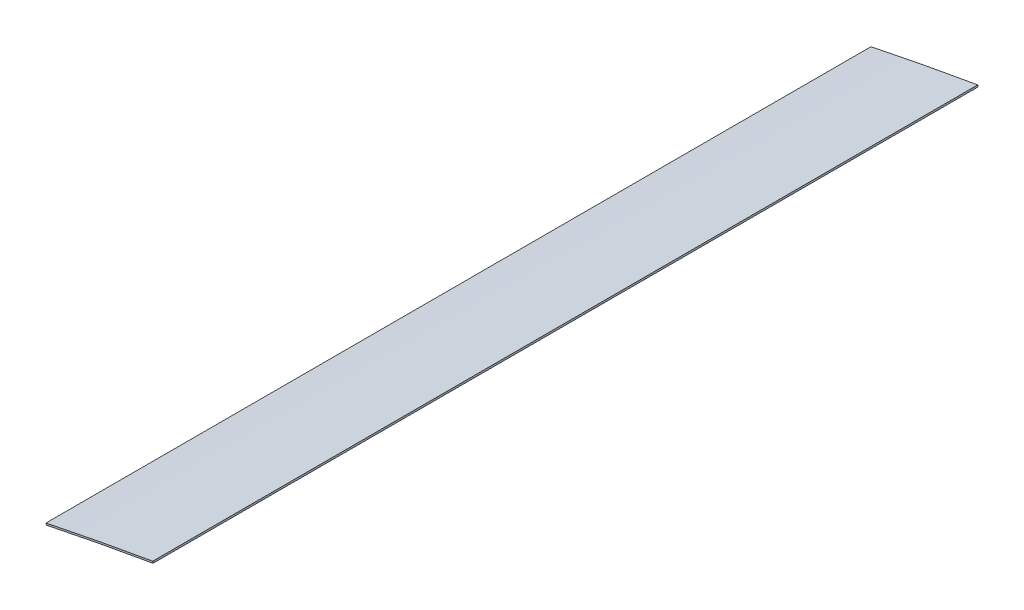
ISO-10303-21;
HEADER;
FILE_DESCRIPTION(('STEP AP214'),'2;1');
FILE_NAME('part.step','',(''),(''),'','','');
FILE_SCHEMA(('AUTOMOTIVE_DESIGN { 1 0 10303 214 1 1 1 1 }'));
ENDSEC;
DATA;
#1=APPLICATION_CONTEXT('core data for automotive mechanical design processes');
#2=APPLICATION_PROTOCOL_DEFINITION('international standard','automotive_design',2000,#1);
#3=PRODUCT_CONTEXT('',#1,'mechanical');
#4=PRODUCT('Part','Part','',(#3));
#5=PRODUCT_RELATED_PRODUCT_CATEGORY('part','',(#4));
#6=PRODUCT_DEFINITION_FORMATION('','',#4);
#7=PRODUCT_DEFINITION_CONTEXT('part definition',#1,'design');
#8=PRODUCT_DEFINITION('design','',#6,#7);
#9=PRODUCT_DEFINITION_SHAPE('','',#8);
#10=(LENGTH_UNIT() NAMED_UNIT(*) SI_UNIT(.MILLI.,.METRE.));
#11=(NAMED_UNIT(*) PLANE_ANGLE_UNIT() SI_UNIT($,.RADIAN.));
#12=(NAMED_UNIT(*) SI_UNIT($,.STERADIAN.) SOLID_ANGLE_UNIT());
#13=UNCERTAINTY_MEASURE_WITH_UNIT(LENGTH_MEASURE(1.E-05),#10,'distance_accuracy_value','');
#14=(GEOMETRIC_REPRESENTATION_CONTEXT(3) GLOBAL_UNCERTAINTY_ASSIGNED_CONTEXT((#13)) GLOBAL_UNIT_ASSIGNED_CONTEXT((#10,
#11,#12)) REPRESENTATION_CONTEXT('',''));
#15=CARTESIAN_POINT('',(0.,0.,0.));
#16=DIRECTION('',(0.,0.,1.));
#17=DIRECTION('',(1.,0.,0.));
#18=AXIS2_PLACEMENT_3D('',#15,#16,#17);
#19=CARTESIAN_POINT('',(-370.271261275174,5.9727732812786,0.));
#20=DIRECTION('',(0.,0.,-1.));
#21=DIRECTION('',(-1.,0.,0.));
#22=AXIS2_PLACEMENT_3D('',#19,#20,#21);
#23=PLANE('',#22);
#24=CARTESIAN_POINT('',(-345.86921952559,10.4034628772873,0.));
#25=CARTESIAN_POINT('',(-349.94203818241,9.69772573854356,0.));
#26=CARTESIAN_POINT('',(-354.012729452607,8.97586416354941,0.));
#27=CARTESIAN_POINT('',(-362.145804591733,7.49934641335859,0.));
#28=CARTESIAN_POINT('',(-366.208147824963,6.74469758212919,0.));
#29=CARTESIAN_POINT('',(-374.334374725386,5.20084898042798,0.));
#30=CARTESIAN_POINT('',(-378.39841229257,4.41162013750127,0.));
#31=CARTESIAN_POINT('',(-384.468085361271,3.20342240883662,0.));
#32=CARTESIAN_POINT('',(-386.486607452505,2.79669155578354,0.));
#33=CARTESIAN_POINT('',(-389.536193606057,2.17804701871457,0.));
#34=CARTESIAN_POINT('',(-390.556809742196,1.97031577031353,0.));
#35=CARTESIAN_POINT('',(-392.57724176466,1.55449947413365,0.));
#36=CARTESIAN_POINT('',(-393.576500528704,1.34652869413316,0.));
#37=CARTESIAN_POINT('',(-394.58041783956,1.13592020313479,0.));
#38=B_SPLINE_CURVE_WITH_KNOTS('',3,(#24,#25,#26,#27,#28,#29,#30,#31,#32,#33,#34,#35,#36,#37),
.UNSPECIFIED.,.F.,.F.,(4,2,2,2,2,2,4),(0.,0.250000000000001,0.500000000000002,0.750000000000002,
0.875000000000001,0.937500000000001,1.),.UNSPECIFIED.);
#39=CARTESIAN_POINT('',(-345.86921952559,10.4034628772873,0.));
#40=VERTEX_POINT('',#39);
#41=CARTESIAN_POINT('',(-394.58041783956,1.13592020313479,0.));
#42=VERTEX_POINT('',#41);
#43=EDGE_CURVE('E85',#40,#42,#38,.T.);
#44=ORIENTED_EDGE('',*,*,#43,.T.);
#45=DIRECTION('',(-0.20531728339943,0.97869546496215,0.));
#46=VECTOR('',#45,1.);
#47=CARTESIAN_POINT('',(-394.417447245861,0.35908067782108,0.));
#48=LINE('',#47,#46);
#49=CARTESIAN_POINT('',(-394.417447245861,0.35908067782108,0.));
#50=VERTEX_POINT('',#49);
#51=EDGE_CURVE('E86',#50,#42,#48,.T.);
#52=ORIENTED_EDGE('',*,*,#51,.F.);
#53=CARTESIAN_POINT('',(-345.733698222766,9.62136758962672,0.));
#54=CARTESIAN_POINT('',(-349.80446700653,8.91598565244432,0.));
#55=CARTESIAN_POINT('',(-357.941676377794,7.47300220886799,0.));
#56=CARTESIAN_POINT('',(-370.122332339644,5.21023980034695,0.));
#57=CARTESIAN_POINT('',(-380.276776503847,3.23826298733725,0.));
#58=CARTESIAN_POINT('',(-387.338257037827,1.81538118105775,0.));
#59=CARTESIAN_POINT('',(-391.417841987052,0.98503984916554,0.));
#60=CARTESIAN_POINT('',(-393.414350382232,0.569517049910392,0.));
#61=CARTESIAN_POINT('',(-394.417447245861,0.35908067782108,0.));
#62=B_SPLINE_CURVE_WITH_KNOTS('',3,(#53,#54,#55,#56,#57,#58,#59,#60,#61),.UNSPECIFIED.,.F.,.F.,
(4,1,1,1,1,1,4),(0.00676290299753232,0.0219498603868585,0.0371368177761848,0.052323775165511,
0.0599172538601741,0.0637139932075056,0.0675107325548372),.UNSPECIFIED.);
#63=CARTESIAN_POINT('',(-345.733698222766,9.62136758962672,0.));
#64=VERTEX_POINT('',#63);
#65=EDGE_CURVE('E94',#64,#50,#62,.T.);
#66=ORIENTED_EDGE('',*,*,#65,.F.);
#67=DIRECTION('',(0.170735499620878,-0.985316897840085,0.));
#68=VECTOR('',#67,1.);
#69=CARTESIAN_POINT('',(-345.86921952559,10.4034628772873,0.));
#70=LINE('',#69,#68);
#71=EDGE_CURVE('E88',#40,#64,#70,.T.);
#72=ORIENTED_EDGE('',*,*,#71,.F.);
#73=EDGE_LOOP('',(#44,#52,#66,#72));
#74=FACE_BOUND('',#73,.T.);
#75=ADVANCED_FACE('F39',(#74),#23,.F.);
#76=CARTESIAN_POINT('',(-394.417447245861,0.35908067782108,-426.357025279608));
#77=DIRECTION('',(0.97869546496215,0.20531728339943,0.));
#78=DIRECTION('',(-0.20531728339943,0.97869546496215,0.));
#79=AXIS2_PLACEMENT_3D('',#76,#77,#78);
#80=PLANE('',#79);
#81=DIRECTION('',(0.,0.,1.));
#82=VECTOR('',#81,1.);
#83=CARTESIAN_POINT('',(-394.58041783956,1.13592020313479,-426.357025279608));
#84=LINE('',#83,#82);
#85=CARTESIAN_POINT('',(-394.58041783956,1.13592020313479,-376.48828125));
#86=VERTEX_POINT('',#85);
#87=EDGE_CURVE('E78',#86,#42,#84,.T.);
#88=ORIENTED_EDGE('',*,*,#87,.F.);
#89=DIRECTION('',(0.20531728339943,-0.97869546496215,0.));
#90=VECTOR('',#89,1.);
#91=CARTESIAN_POINT('',(-394.417447245861,0.35908067782108,-376.48828125));
#92=LINE('',#91,#90);
#93=CARTESIAN_POINT('',(-394.417447245861,0.35908067782108,-376.48828125));
#94=VERTEX_POINT('',#93);
#95=EDGE_CURVE('E42',#86,#94,#92,.T.);
#96=ORIENTED_EDGE('',*,*,#95,.T.);
#97=DIRECTION('',(0.,0.,1.));
#98=VECTOR('',#97,1.);
#99=CARTESIAN_POINT('',(-394.417447245861,0.35908067782108,-426.357025279608));
#100=LINE('',#99,#98);
#101=EDGE_CURVE('E83',#94,#50,#100,.T.);
#102=ORIENTED_EDGE('',*,*,#101,.T.);
#103=ORIENTED_EDGE('',*,*,#51,.T.);
#104=EDGE_LOOP('',(#88,#96,#102,#103));
#105=FACE_BOUND('',#104,.T.);
#106=ADVANCED_FACE('F90',(#105),#80,.F.);
#107=CARTESIAN_POINT('',(-345.733698222766,9.62136758962672,-426.357025279608));
#108=CARTESIAN_POINT('',(-349.80446700653,8.91598565244432,-426.357025279608));
#109=CARTESIAN_POINT('',(-357.941676377794,7.47300220886799,-426.357025279608));
#110=CARTESIAN_POINT('',(-370.122332339644,5.21023980034695,-426.357025279608));
#111=CARTESIAN_POINT('',(-380.276776503847,3.23826298733725,-426.357025279608));
#112=CARTESIAN_POINT('',(-387.338257037827,1.81538118105775,-426.357025279608));
#113=CARTESIAN_POINT('',(-391.417841987052,0.98503984916554,-426.357025279608));
#114=CARTESIAN_POINT('',(-393.414350382232,0.569517049910392,-426.357025279608));
#115=CARTESIAN_POINT('',(-394.417447245861,0.35908067782108,-426.357025279608));
#116=B_SPLINE_CURVE_WITH_KNOTS('',3,(#107,#108,#109,#110,#111,#112,#113,#114,#115),
.UNSPECIFIED.,.F.,.F.,(4,1,1,1,1,1,4),(0.00676290299753232,0.0219498603868585,
0.0371368177761848,0.052323775165511,0.0599172538601741,0.0637139932075056,0.0675107325548372),.UNSPECIFIED.);
#117=DIRECTION('',(0.,0.,1.));
#118=VECTOR('',#117,1.);
#119=SURFACE_OF_LINEAR_EXTRUSION('',#116,#118);
#120=ORIENTED_EDGE('',*,*,#101,.F.);
#121=CARTESIAN_POINT('',(-345.733698222766,9.62136758962672,-376.48828125));
#122=CARTESIAN_POINT('',(-349.80446700653,8.91598565244432,-376.48828125));
#123=CARTESIAN_POINT('',(-357.941676377794,7.47300220886799,-376.48828125));
#124=CARTESIAN_POINT('',(-370.122332339644,5.21023980034695,-376.48828125));
#125=CARTESIAN_POINT('',(-380.276776503847,3.23826298733725,-376.48828125));
#126=CARTESIAN_POINT('',(-387.338257037827,1.81538118105775,-376.48828125));
#127=CARTESIAN_POINT('',(-391.417841987052,0.98503984916554,-376.48828125));
#128=CARTESIAN_POINT('',(-393.414350382232,0.569517049910392,-376.48828125));
#129=CARTESIAN_POINT('',(-394.417447245861,0.35908067782108,-376.48828125));
#130=B_SPLINE_CURVE_WITH_KNOTS('',3,(#121,#122,#123,#124,#125,#126,#127,#128,#129),
.UNSPECIFIED.,.F.,.F.,(4,1,1,1,1,1,4),(0.00676290299753232,0.0219498603868585,
0.0371368177761848,0.052323775165511,0.0599172538601741,0.0637139932075056,0.0675107325548372),.UNSPECIFIED.);
#131=CARTESIAN_POINT('',(-345.733698222766,9.62136758962672,-376.48828125));
#132=VERTEX_POINT('',#131);
#133=EDGE_CURVE('E124',#94,#132,#130,.F.);
#134=ORIENTED_EDGE('',*,*,#133,.T.);
#135=DIRECTION('',(0.,0.,1.));
#136=VECTOR('',#135,1.);
#137=CARTESIAN_POINT('',(-345.733698222766,9.62136758962672,-426.357025279608));
#138=LINE('',#137,#136);
#139=EDGE_CURVE('E120',#132,#64,#138,.T.);
#140=ORIENTED_EDGE('',*,*,#139,.T.);
#141=ORIENTED_EDGE('',*,*,#65,.T.);
#142=EDGE_LOOP('',(#120,#134,#140,#141));
#143=FACE_BOUND('',#142,.T.);
#144=ADVANCED_FACE('F125',(#143),#119,.F.);
#145=CARTESIAN_POINT('',(-345.86921952559,10.4034628772873,-426.357025279608));
#146=DIRECTION('',(-0.985316897840085,-0.170735499620878,0.));
#147=DIRECTION('',(0.170735499620878,-0.985316897840085,0.));
#148=AXIS2_PLACEMENT_3D('',#145,#146,#147);
#149=PLANE('',#148);
#150=ORIENTED_EDGE('',*,*,#139,.F.);
#151=DIRECTION('',(-0.170735499620878,0.985316897840085,0.));
#152=VECTOR('',#151,1.);
#153=CARTESIAN_POINT('',(-345.86921952559,10.4034628772873,-376.48828125));
#154=LINE('',#153,#152);
#155=CARTESIAN_POINT('',(-345.86921952559,10.4034628772873,-376.48828125));
#156=VERTEX_POINT('',#155);
#157=EDGE_CURVE('E47',#132,#156,#154,.T.);
#158=ORIENTED_EDGE('',*,*,#157,.T.);
#159=DIRECTION('',(0.,0.,1.));
#160=VECTOR('',#159,1.);
#161=CARTESIAN_POINT('',(-345.86921952559,10.4034628772873,-426.357025279608));
#162=LINE('',#161,#160);
#163=EDGE_CURVE('E119',#156,#40,#162,.T.);
#164=ORIENTED_EDGE('',*,*,#163,.T.);
#165=ORIENTED_EDGE('',*,*,#71,.T.);
#166=EDGE_LOOP('',(#150,#158,#164,#165));
#167=FACE_BOUND('',#166,.T.);
#168=ADVANCED_FACE('F123',(#167),#149,.F.);
#169=CARTESIAN_POINT('',(-345.86921952559,10.4034628772873,-426.357025279608));
#170=CARTESIAN_POINT('',(-349.94203818241,9.69772573854356,-426.357025279608));
#171=CARTESIAN_POINT('',(-354.012729452607,8.97586416354941,-426.357025279608));
#172=CARTESIAN_POINT('',(-362.145804591733,7.49934641335859,-426.357025279608));
#173=CARTESIAN_POINT('',(-366.208147824963,6.74469758212919,-426.357025279608));
#174=CARTESIAN_POINT('',(-374.334374725386,5.20084898042798,-426.357025279608));
#175=CARTESIAN_POINT('',(-378.39841229257,4.41162013750127,-426.357025279608));
#176=CARTESIAN_POINT('',(-384.468085361271,3.20342240883662,-426.357025279608));
#177=CARTESIAN_POINT('',(-386.486607452505,2.79669155578354,-426.357025279608));
#178=CARTESIAN_POINT('',(-389.536193606057,2.17804701871457,-426.357025279608));
#179=CARTESIAN_POINT('',(-390.556809742196,1.97031577031353,-426.357025279608));
#180=CARTESIAN_POINT('',(-392.57724176466,1.55449947413365,-426.357025279608));
#181=CARTESIAN_POINT('',(-393.576500528704,1.34652869413316,-426.357025279608));
#182=CARTESIAN_POINT('',(-394.58041783956,1.13592020313479,-426.357025279608));
#183=B_SPLINE_CURVE_WITH_KNOTS('',3,(#169,#170,#171,#172,#173,#174,#175,#176,#177,#178,#179,
#180,#181,#182),.UNSPECIFIED.,.F.,.F.,(4,2,2,2,2,2,4),(0.,0.250000000000001,0.500000000000002,
0.750000000000002,0.875000000000001,0.937500000000001,1.),.UNSPECIFIED.);
#184=DIRECTION('',(0.,0.,1.));
#185=VECTOR('',#184,1.);
#186=SURFACE_OF_LINEAR_EXTRUSION('',#183,#185);
#187=CARTESIAN_POINT('',(-345.86921952559,10.4034628772873,-376.48828125));
#188=CARTESIAN_POINT('',(-349.94203818241,9.69772573854356,-376.48828125));
#189=CARTESIAN_POINT('',(-354.012729452607,8.97586416354941,-376.48828125));
#190=CARTESIAN_POINT('',(-362.145804591733,7.49934641335859,-376.48828125));
#191=CARTESIAN_POINT('',(-366.208147824963,6.74469758212919,-376.48828125));
#192=CARTESIAN_POINT('',(-374.334374725386,5.20084898042798,-376.48828125));
#193=CARTESIAN_POINT('',(-378.39841229257,4.41162013750127,-376.48828125));
#194=CARTESIAN_POINT('',(-384.468085361271,3.20342240883662,-376.48828125));
#195=CARTESIAN_POINT('',(-386.486607452505,2.79669155578354,-376.48828125));
#196=CARTESIAN_POINT('',(-389.536193606057,2.17804701871457,-376.48828125));
#197=CARTESIAN_POINT('',(-390.556809742196,1.97031577031353,-376.48828125));
#198=CARTESIAN_POINT('',(-392.57724176466,1.55449947413365,-376.48828125));
#199=CARTESIAN_POINT('',(-393.576500528704,1.34652869413316,-376.48828125));
#200=CARTESIAN_POINT('',(-394.58041783956,1.13592020313479,-376.48828125));
#201=B_SPLINE_CURVE_WITH_KNOTS('',3,(#187,#188,#189,#190,#191,#192,#193,#194,#195,#196,#197,
#198,#199,#200),.UNSPECIFIED.,.F.,.F.,(4,2,2,2,2,2,4),(0.,0.250000000000001,0.500000000000002,
0.750000000000002,0.875000000000001,0.937500000000001,1.),.UNSPECIFIED.);
#202=EDGE_CURVE('E11',#86,#156,#201,.F.);
#203=ORIENTED_EDGE('',*,*,#202,.F.);
#204=ORIENTED_EDGE('',*,*,#87,.T.);
#205=ORIENTED_EDGE('',*,*,#43,.F.);
#206=ORIENTED_EDGE('',*,*,#163,.F.);
#207=EDGE_LOOP('',(#203,#204,#205,#206));
#208=FACE_BOUND('',#207,.T.);
#209=ADVANCED_FACE('F41',(#208),#186,.T.);
#210=CARTESIAN_POINT('',(-0.400092727756273,2.26292544800455,-376.48828125));
#211=DIRECTION('',(0.,0.,1.));
#212=DIRECTION('',(1.,0.,0.));
#213=AXIS2_PLACEMENT_3D('',#210,#211,#212);
#214=PLANE('',#213);
#215=ORIENTED_EDGE('',*,*,#202,.T.);
#216=ORIENTED_EDGE('',*,*,#157,.F.);
#217=ORIENTED_EDGE('',*,*,#133,.F.);
#218=ORIENTED_EDGE('',*,*,#95,.F.);
#219=EDGE_LOOP('',(#215,#216,#217,#218));
#220=FACE_BOUND('',#219,.T.);
#221=ADVANCED_FACE('F145',(#220),#214,.F.);
#222=CLOSED_SHELL('',(#75,#106,#144,#168,#209,#221));
#223=MANIFOLD_SOLID_BREP('B2',#222);
#224=ADVANCED_BREP_SHAPE_REPRESENTATION('',(#18,#223),#14);
#225=SHAPE_DEFINITION_REPRESENTATION(#9,#224);
ENDSEC;
END-ISO-10303-21;
